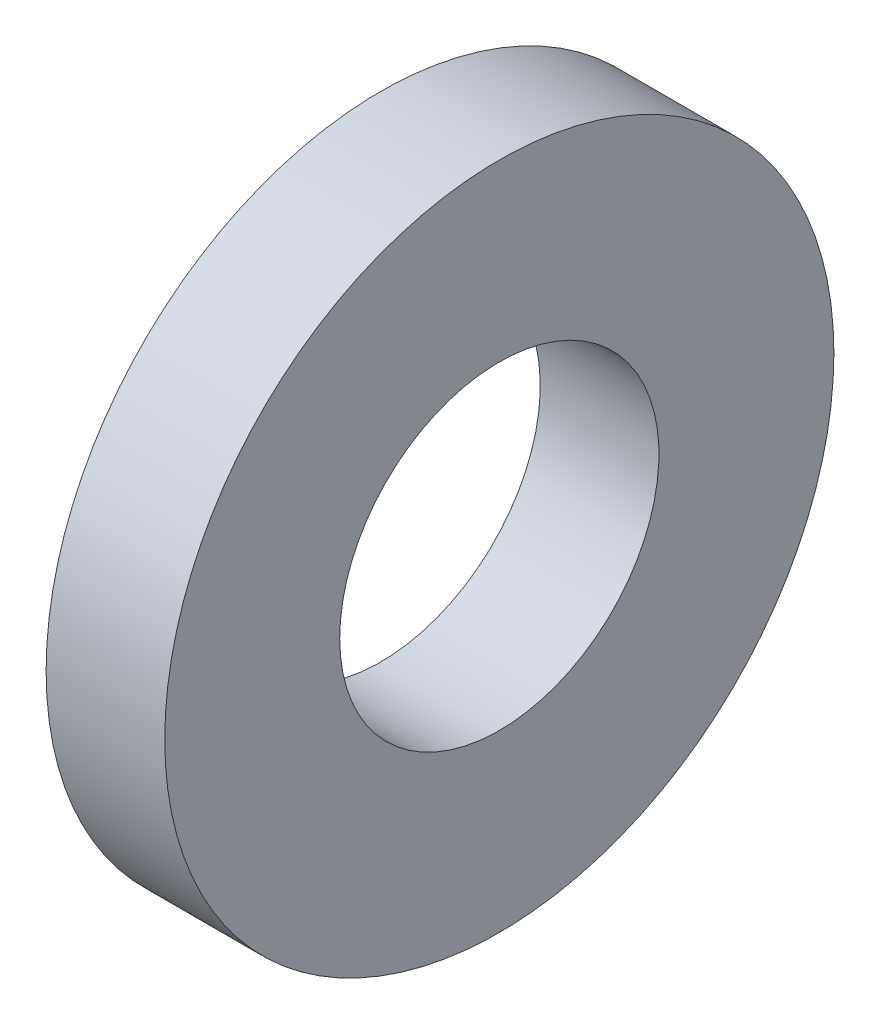
ISO-10303-21;
HEADER;
FILE_DESCRIPTION(('STEP AP214'),'2;1');
FILE_NAME('part.step','',(''),(''),'','','');
FILE_SCHEMA(('AUTOMOTIVE_DESIGN { 1 0 10303 214 1 1 1 1 }'));
ENDSEC;
DATA;
#1=APPLICATION_CONTEXT('core data for automotive mechanical design processes');
#2=APPLICATION_PROTOCOL_DEFINITION('international standard','automotive_design',2000,#1);
#3=PRODUCT_CONTEXT('',#1,'mechanical');
#4=PRODUCT('Part','Part','',(#3));
#5=PRODUCT_RELATED_PRODUCT_CATEGORY('part','',(#4));
#6=PRODUCT_DEFINITION_FORMATION('','',#4);
#7=PRODUCT_DEFINITION_CONTEXT('part definition',#1,'design');
#8=PRODUCT_DEFINITION('design','',#6,#7);
#9=PRODUCT_DEFINITION_SHAPE('','',#8);
#10=(LENGTH_UNIT() NAMED_UNIT(*) SI_UNIT(.MILLI.,.METRE.));
#11=(NAMED_UNIT(*) PLANE_ANGLE_UNIT() SI_UNIT($,.RADIAN.));
#12=(NAMED_UNIT(*) SI_UNIT($,.STERADIAN.) SOLID_ANGLE_UNIT());
#13=UNCERTAINTY_MEASURE_WITH_UNIT(LENGTH_MEASURE(1.E-05),#10,'distance_accuracy_value','');
#14=(GEOMETRIC_REPRESENTATION_CONTEXT(3) GLOBAL_UNCERTAINTY_ASSIGNED_CONTEXT((#13)) GLOBAL_UNIT_ASSIGNED_CONTEXT((#10,
#11,#12)) REPRESENTATION_CONTEXT('',''));
#15=CARTESIAN_POINT('',(0.,0.,0.));
#16=DIRECTION('',(0.,0.,1.));
#17=DIRECTION('',(1.,0.,0.));
#18=AXIS2_PLACEMENT_3D('',#15,#16,#17);
#19=CARTESIAN_POINT('',(9.525,0.,0.));
#20=DIRECTION('',(1.,0.,0.));
#21=DIRECTION('',(0.,0.,-1.));
#22=AXIS2_PLACEMENT_3D('',#19,#20,#21);
#23=PLANE('',#22);
#24=CARTESIAN_POINT('',(9.525,0.,0.));
#25=DIRECTION('',(1.,0.,0.));
#26=DIRECTION('',(0.,0.,-1.));
#27=AXIS2_PLACEMENT_3D('',#24,#25,#26);
#28=CIRCLE('',#27,26.8605);
#29=CARTESIAN_POINT('',(9.525,0.,26.8605));
#30=VERTEX_POINT('',#29);
#31=EDGE_CURVE('E11',#30,#30,#28,.T.);
#32=ORIENTED_EDGE('',*,*,#31,.T.);
#33=EDGE_LOOP('',(#32));
#34=FACE_BOUND('',#33,.T.);
#35=CARTESIAN_POINT('',(9.525,0.,0.));
#36=DIRECTION('',(1.,0.,0.));
#37=DIRECTION('',(0.,0.,-1.));
#38=AXIS2_PLACEMENT_3D('',#35,#36,#37);
#39=CIRCLE('',#38,12.8143);
#40=CARTESIAN_POINT('',(9.525,0.,12.8143));
#41=VERTEX_POINT('',#40);
#42=EDGE_CURVE('E44',#41,#41,#39,.T.);
#43=ORIENTED_EDGE('',*,*,#42,.F.);
#44=EDGE_LOOP('',(#43));
#45=FACE_BOUND('',#44,.T.);
#46=ADVANCED_FACE('F32',(#34,#45),#23,.T.);
#47=CARTESIAN_POINT('',(0.,0.,0.));
#48=DIRECTION('',(1.,0.,0.));
#49=DIRECTION('',(0.,0.,-1.));
#50=AXIS2_PLACEMENT_3D('',#47,#48,#49);
#51=PLANE('',#50);
#52=CARTESIAN_POINT('',(0.,0.,0.));
#53=DIRECTION('',(1.,0.,0.));
#54=DIRECTION('',(0.,0.,-1.));
#55=AXIS2_PLACEMENT_3D('',#52,#53,#54);
#56=CIRCLE('',#55,26.8605);
#57=CARTESIAN_POINT('',(0.,0.,26.8605));
#58=VERTEX_POINT('',#57);
#59=EDGE_CURVE('E36',#58,#58,#56,.T.);
#60=ORIENTED_EDGE('',*,*,#59,.F.);
#61=EDGE_LOOP('',(#60));
#62=FACE_BOUND('',#61,.T.);
#63=CARTESIAN_POINT('',(0.,0.,0.));
#64=DIRECTION('',(1.,0.,0.));
#65=DIRECTION('',(0.,0.,-1.));
#66=AXIS2_PLACEMENT_3D('',#63,#64,#65);
#67=CIRCLE('',#66,12.8143);
#68=CARTESIAN_POINT('',(0.,0.,12.8143));
#69=VERTEX_POINT('',#68);
#70=EDGE_CURVE('E46',#69,#69,#67,.T.);
#71=ORIENTED_EDGE('',*,*,#70,.T.);
#72=EDGE_LOOP('',(#71));
#73=FACE_BOUND('',#72,.T.);
#74=ADVANCED_FACE('F57',(#62,#73),#51,.F.);
#75=CARTESIAN_POINT('',(9.525,0.,0.));
#76=DIRECTION('',(-1.,0.,0.));
#77=DIRECTION('',(0.,0.,1.));
#78=AXIS2_PLACEMENT_3D('',#75,#76,#77);
#79=CYLINDRICAL_SURFACE('',#78,26.8605);
#80=CARTESIAN_POINT('',(9.525,0.,26.8605));
#81=CARTESIAN_POINT('',(9.42578125,0.,26.8605));
#82=CARTESIAN_POINT('',(9.3265625,0.,26.8605));
#83=CARTESIAN_POINT('',(9.128125,0.,26.8605));
#84=CARTESIAN_POINT('',(9.02890625,0.,26.8605));
#85=CARTESIAN_POINT('',(8.83046875,0.,26.8605));
#86=CARTESIAN_POINT('',(8.73125,0.,26.8605));
#87=CARTESIAN_POINT('',(8.5328125,0.,26.8605));
#88=CARTESIAN_POINT('',(8.43359375,0.,26.8605));
#89=CARTESIAN_POINT('',(8.23515625,0.,26.8605));
#90=CARTESIAN_POINT('',(8.1359375,0.,26.8605));
#91=CARTESIAN_POINT('',(7.9375,0.,26.8605));
#92=CARTESIAN_POINT('',(7.83828125,0.,26.8605));
#93=CARTESIAN_POINT('',(7.63984375,0.,26.8605));
#94=CARTESIAN_POINT('',(7.540625,0.,26.8605));
#95=CARTESIAN_POINT('',(7.3421875,0.,26.8605));
#96=CARTESIAN_POINT('',(7.24296875,0.,26.8605));
#97=CARTESIAN_POINT('',(7.04453125,0.,26.8605));
#98=CARTESIAN_POINT('',(6.9453125,0.,26.8605));
#99=CARTESIAN_POINT('',(6.746875,0.,26.8605));
#100=CARTESIAN_POINT('',(6.64765625,0.,26.8605));
#101=CARTESIAN_POINT('',(6.44921875,0.,26.8605));
#102=CARTESIAN_POINT('',(6.35,0.,26.8605));
#103=CARTESIAN_POINT('',(6.1515625,0.,26.8605));
#104=CARTESIAN_POINT('',(6.05234375,0.,26.8605));
#105=CARTESIAN_POINT('',(5.85390625,0.,26.8605));
#106=CARTESIAN_POINT('',(5.7546875,0.,26.8605));
#107=CARTESIAN_POINT('',(5.55625,0.,26.8605));
#108=CARTESIAN_POINT('',(5.45703125,0.,26.8605));
#109=CARTESIAN_POINT('',(5.25859375,0.,26.8605));
#110=CARTESIAN_POINT('',(5.159375,0.,26.8605));
#111=CARTESIAN_POINT('',(4.9609375,0.,26.8605));
#112=CARTESIAN_POINT('',(4.86171875,0.,26.8605));
#113=CARTESIAN_POINT('',(4.66328125,0.,26.8605));
#114=CARTESIAN_POINT('',(4.5640625,0.,26.8605));
#115=CARTESIAN_POINT('',(4.365625,0.,26.8605));
#116=CARTESIAN_POINT('',(4.26640625,0.,26.8605));
#117=CARTESIAN_POINT('',(4.06796875,0.,26.8605));
#118=CARTESIAN_POINT('',(3.96875,0.,26.8605));
#119=CARTESIAN_POINT('',(3.7703125,0.,26.8605));
#120=CARTESIAN_POINT('',(3.67109375,0.,26.8605));
#121=CARTESIAN_POINT('',(3.47265625,0.,26.8605));
#122=CARTESIAN_POINT('',(3.3734375,0.,26.8605));
#123=CARTESIAN_POINT('',(3.175,0.,26.8605));
#124=CARTESIAN_POINT('',(3.07578125,0.,26.8605));
#125=CARTESIAN_POINT('',(2.87734375,0.,26.8605));
#126=CARTESIAN_POINT('',(2.778125,0.,26.8605));
#127=CARTESIAN_POINT('',(2.5796875,0.,26.8605));
#128=CARTESIAN_POINT('',(2.48046875,0.,26.8605));
#129=CARTESIAN_POINT('',(2.28203125,0.,26.8605));
#130=CARTESIAN_POINT('',(2.1828125,0.,26.8605));
#131=CARTESIAN_POINT('',(1.984375,0.,26.8605));
#132=CARTESIAN_POINT('',(1.88515625,0.,26.8605));
#133=CARTESIAN_POINT('',(1.68671875,0.,26.8605));
#134=CARTESIAN_POINT('',(1.5875,0.,26.8605));
#135=CARTESIAN_POINT('',(1.3890625,0.,26.8605));
#136=CARTESIAN_POINT('',(1.28984375,0.,26.8605));
#137=CARTESIAN_POINT('',(1.09140625,0.,26.8605));
#138=CARTESIAN_POINT('',(0.992187500000001,0.,26.8605));
#139=CARTESIAN_POINT('',(0.793750000000001,0.,26.8605));
#140=CARTESIAN_POINT('',(0.69453125,0.,26.8605));
#141=CARTESIAN_POINT('',(0.49609375,0.,26.8605));
#142=CARTESIAN_POINT('',(0.396875,0.,26.8605));
#143=CARTESIAN_POINT('',(0.1984375,0.,26.8605));
#144=CARTESIAN_POINT('',(0.0992187500000001,0.,26.8605));
#145=CARTESIAN_POINT('',(0.,0.,26.8605));
#146=B_SPLINE_CURVE_WITH_KNOTS('',3,(#80,#81,#82,#83,#84,#85,#86,#87,#88,#89,#90,#91,#92,#93,
#94,#95,#96,#97,#98,#99,#100,#101,#102,#103,#104,#105,#106,#107,#108,#109,#110,#111,#112,#113,
#114,#115,#116,#117,#118,#119,#120,#121,#122,#123,#124,#125,#126,#127,#128,#129,#130,#131,#132,
#133,#134,#135,#136,#137,#138,#139,#140,#141,#142,#143,#144,#145),.UNSPECIFIED.,.F.,.F.,(4,2,2,
2,2,2,2,2,2,2,2,2,2,2,2,2,2,2,2,2,2,2,2,2,2,2,2,2,2,2,2,2,4),(0.,0.29765625,0.5953125,
0.892968750000001,1.190625,1.48828125,1.7859375,2.08359375,2.38125,2.67890625,2.9765625,
3.27421875,3.571875,3.86953125,4.1671875,4.46484375,4.7625,5.06015625,5.3578125,5.65546875,
5.953125,6.25078125,6.5484375,6.84609375,7.14375,7.44140625,7.7390625,8.03671875,8.334375,
8.63203125,8.9296875,9.22734375,9.525),.UNSPECIFIED.);
#147=EDGE_CURVE('BSEAM34',#30,#58,#146,.T.);
#148=ORIENTED_EDGE('',*,*,#31,.F.);
#149=ORIENTED_EDGE('',*,*,#59,.T.);
#150=ORIENTED_EDGE('',*,*,#147,.T.);
#151=ORIENTED_EDGE('',*,*,#147,.F.);
#152=EDGE_LOOP('',(#148,#150,#149,#151));
#153=FACE_BOUND('',#152,.T.);
#154=ADVANCED_FACE('F34',(#153),#79,.T.);
#155=CARTESIAN_POINT('',(9.525,0.,0.));
#156=DIRECTION('',(-1.,0.,0.));
#157=DIRECTION('',(0.,0.,1.));
#158=AXIS2_PLACEMENT_3D('',#155,#156,#157);
#159=CYLINDRICAL_SURFACE('',#158,12.8143);
#160=CARTESIAN_POINT('',(9.525,0.,12.8143));
#161=CARTESIAN_POINT('',(9.42578125,0.,12.8143));
#162=CARTESIAN_POINT('',(9.3265625,0.,12.8143));
#163=CARTESIAN_POINT('',(9.128125,0.,12.8143));
#164=CARTESIAN_POINT('',(9.02890625,0.,12.8143));
#165=CARTESIAN_POINT('',(8.83046875,0.,12.8143));
#166=CARTESIAN_POINT('',(8.73125,0.,12.8143));
#167=CARTESIAN_POINT('',(8.5328125,0.,12.8143));
#168=CARTESIAN_POINT('',(8.43359375,0.,12.8143));
#169=CARTESIAN_POINT('',(8.23515625,0.,12.8143));
#170=CARTESIAN_POINT('',(8.1359375,0.,12.8143));
#171=CARTESIAN_POINT('',(7.9375,0.,12.8143));
#172=CARTESIAN_POINT('',(7.83828125,0.,12.8143));
#173=CARTESIAN_POINT('',(7.63984375,0.,12.8143));
#174=CARTESIAN_POINT('',(7.540625,0.,12.8143));
#175=CARTESIAN_POINT('',(7.3421875,0.,12.8143));
#176=CARTESIAN_POINT('',(7.24296875,0.,12.8143));
#177=CARTESIAN_POINT('',(7.04453125,0.,12.8143));
#178=CARTESIAN_POINT('',(6.9453125,0.,12.8143));
#179=CARTESIAN_POINT('',(6.746875,0.,12.8143));
#180=CARTESIAN_POINT('',(6.64765625,0.,12.8143));
#181=CARTESIAN_POINT('',(6.44921875,0.,12.8143));
#182=CARTESIAN_POINT('',(6.35,0.,12.8143));
#183=CARTESIAN_POINT('',(6.1515625,0.,12.8143));
#184=CARTESIAN_POINT('',(6.05234375,0.,12.8143));
#185=CARTESIAN_POINT('',(5.85390625,0.,12.8143));
#186=CARTESIAN_POINT('',(5.7546875,0.,12.8143));
#187=CARTESIAN_POINT('',(5.55625,0.,12.8143));
#188=CARTESIAN_POINT('',(5.45703125,0.,12.8143));
#189=CARTESIAN_POINT('',(5.25859375,0.,12.8143));
#190=CARTESIAN_POINT('',(5.159375,0.,12.8143));
#191=CARTESIAN_POINT('',(4.9609375,0.,12.8143));
#192=CARTESIAN_POINT('',(4.86171875,0.,12.8143));
#193=CARTESIAN_POINT('',(4.66328125,0.,12.8143));
#194=CARTESIAN_POINT('',(4.5640625,0.,12.8143));
#195=CARTESIAN_POINT('',(4.365625,0.,12.8143));
#196=CARTESIAN_POINT('',(4.26640625,0.,12.8143));
#197=CARTESIAN_POINT('',(4.06796875,0.,12.8143));
#198=CARTESIAN_POINT('',(3.96875,0.,12.8143));
#199=CARTESIAN_POINT('',(3.7703125,0.,12.8143));
#200=CARTESIAN_POINT('',(3.67109375,0.,12.8143));
#201=CARTESIAN_POINT('',(3.47265625,0.,12.8143));
#202=CARTESIAN_POINT('',(3.3734375,0.,12.8143));
#203=CARTESIAN_POINT('',(3.175,0.,12.8143));
#204=CARTESIAN_POINT('',(3.07578125,0.,12.8143));
#205=CARTESIAN_POINT('',(2.87734375,0.,12.8143));
#206=CARTESIAN_POINT('',(2.778125,0.,12.8143));
#207=CARTESIAN_POINT('',(2.5796875,0.,12.8143));
#208=CARTESIAN_POINT('',(2.48046875,0.,12.8143));
#209=CARTESIAN_POINT('',(2.28203125,0.,12.8143));
#210=CARTESIAN_POINT('',(2.1828125,0.,12.8143));
#211=CARTESIAN_POINT('',(1.984375,0.,12.8143));
#212=CARTESIAN_POINT('',(1.88515625,0.,12.8143));
#213=CARTESIAN_POINT('',(1.68671875,0.,12.8143));
#214=CARTESIAN_POINT('',(1.5875,0.,12.8143));
#215=CARTESIAN_POINT('',(1.3890625,0.,12.8143));
#216=CARTESIAN_POINT('',(1.28984375,0.,12.8143));
#217=CARTESIAN_POINT('',(1.09140625,0.,12.8143));
#218=CARTESIAN_POINT('',(0.992187500000001,0.,12.8143));
#219=CARTESIAN_POINT('',(0.793750000000001,0.,12.8143));
#220=CARTESIAN_POINT('',(0.69453125,0.,12.8143));
#221=CARTESIAN_POINT('',(0.49609375,0.,12.8143));
#222=CARTESIAN_POINT('',(0.396875,0.,12.8143));
#223=CARTESIAN_POINT('',(0.1984375,0.,12.8143));
#224=CARTESIAN_POINT('',(0.0992187500000001,0.,12.8143));
#225=CARTESIAN_POINT('',(0.,0.,12.8143));
#226=B_SPLINE_CURVE_WITH_KNOTS('',3,(#160,#161,#162,#163,#164,#165,#166,#167,#168,#169,#170,
#171,#172,#173,#174,#175,#176,#177,#178,#179,#180,#181,#182,#183,#184,#185,#186,#187,#188,#189,
#190,#191,#192,#193,#194,#195,#196,#197,#198,#199,#200,#201,#202,#203,#204,#205,#206,#207,#208,
#209,#210,#211,#212,#213,#214,#215,#216,#217,#218,#219,#220,#221,#222,#223,#224,#225),
.UNSPECIFIED.,.F.,.F.,(4,2,2,2,2,2,2,2,2,2,2,2,2,2,2,2,2,2,2,2,2,2,2,2,2,2,2,2,2,2,2,2,4),(0.,
0.297656249999998,0.595312499999999,0.892968749999999,1.190625,1.48828125,1.7859375,2.08359375,
2.38125,2.67890625,2.9765625,3.27421875,3.571875,3.86953125,4.1671875,4.46484375,4.7625,
5.06015625,5.3578125,5.65546875,5.953125,6.25078125,6.5484375,6.84609375,7.14375,7.44140625,
7.7390625,8.03671875,8.334375,8.63203125,8.9296875,9.22734375,9.525),.UNSPECIFIED.);
#227=EDGE_CURVE('BSEAM53',#41,#69,#226,.T.);
#228=ORIENTED_EDGE('',*,*,#42,.T.);
#229=ORIENTED_EDGE('',*,*,#70,.F.);
#230=ORIENTED_EDGE('',*,*,#227,.T.);
#231=ORIENTED_EDGE('',*,*,#227,.F.);
#232=EDGE_LOOP('',(#228,#230,#229,#231));
#233=FACE_BOUND('',#232,.T.);
#234=ADVANCED_FACE('F53',(#233),#159,.F.);
#235=CLOSED_SHELL('',(#46,#74,#154,#234));
#236=MANIFOLD_SOLID_BREP('B2',#235);
#237=ADVANCED_BREP_SHAPE_REPRESENTATION('',(#18,#236),#14);
#238=SHAPE_DEFINITION_REPRESENTATION(#9,#237);
ENDSEC;
END-ISO-10303-21;
